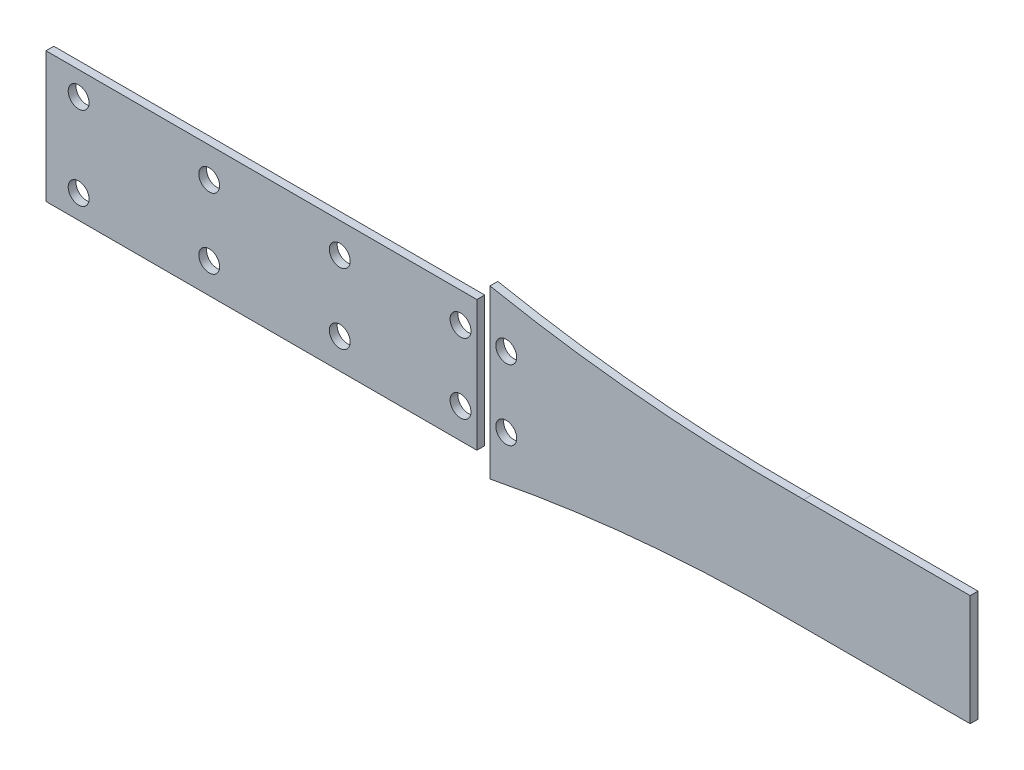
ISO-10303-21;
HEADER;
FILE_DESCRIPTION(('STEP AP214'),'2;1');
FILE_NAME('part.step','',(''),(''),'','','');
FILE_SCHEMA(('AUTOMOTIVE_DESIGN { 1 0 10303 214 1 1 1 1 }'));
ENDSEC;
DATA;
#1=APPLICATION_CONTEXT('core data for automotive mechanical design processes');
#2=APPLICATION_PROTOCOL_DEFINITION('international standard','automotive_design',2000,#1);
#3=PRODUCT_CONTEXT('',#1,'mechanical');
#4=PRODUCT('Part','Part','',(#3));
#5=PRODUCT_RELATED_PRODUCT_CATEGORY('part','',(#4));
#6=PRODUCT_DEFINITION_FORMATION('','',#4);
#7=PRODUCT_DEFINITION_CONTEXT('part definition',#1,'design');
#8=PRODUCT_DEFINITION('design','',#6,#7);
#9=PRODUCT_DEFINITION_SHAPE('','',#8);
#10=(LENGTH_UNIT() NAMED_UNIT(*) SI_UNIT(.MILLI.,.METRE.));
#11=(NAMED_UNIT(*) PLANE_ANGLE_UNIT() SI_UNIT($,.RADIAN.));
#12=(NAMED_UNIT(*) SI_UNIT($,.STERADIAN.) SOLID_ANGLE_UNIT());
#13=UNCERTAINTY_MEASURE_WITH_UNIT(LENGTH_MEASURE(1.E-05),#10,'distance_accuracy_value','');
#14=(GEOMETRIC_REPRESENTATION_CONTEXT(3) GLOBAL_UNCERTAINTY_ASSIGNED_CONTEXT((#13)) GLOBAL_UNIT_ASSIGNED_CONTEXT((#10,
#11,#12)) REPRESENTATION_CONTEXT('',''));
#15=CARTESIAN_POINT('',(0.,0.,0.));
#16=DIRECTION('',(0.,0.,1.));
#17=DIRECTION('',(1.,0.,0.));
#18=AXIS2_PLACEMENT_3D('',#15,#16,#17);
#19=CARTESIAN_POINT('',(134.101357241986,-4.,-0.6));
#20=DIRECTION('',(1.,0.,0.));
#21=DIRECTION('',(0.,0.,-1.));
#22=AXIS2_PLACEMENT_3D('',#19,#20,#21);
#23=PLANE('',#22);
#24=DIRECTION('',(0.,0.,1.));
#25=VECTOR('',#24,1.);
#26=CARTESIAN_POINT('',(134.101357241986,16.,-0.6));
#27=LINE('',#26,#25);
#28=CARTESIAN_POINT('',(134.101357241986,16.,-0.6));
#29=VERTEX_POINT('',#28);
#30=CARTESIAN_POINT('',(134.101357241986,16.,0.6));
#31=VERTEX_POINT('',#30);
#32=EDGE_CURVE('E49',#29,#31,#27,.T.);
#33=ORIENTED_EDGE('',*,*,#32,.T.);
#34=DIRECTION('',(0.,1.,0.));
#35=VECTOR('',#34,1.);
#36=CARTESIAN_POINT('',(134.101357241986,-4.,0.6));
#37=LINE('',#36,#35);
#38=CARTESIAN_POINT('',(134.101357241986,-4.,0.6));
#39=VERTEX_POINT('',#38);
#40=EDGE_CURVE('E86',#39,#31,#37,.T.);
#41=ORIENTED_EDGE('',*,*,#40,.F.);
#42=DIRECTION('',(0.,0.,1.));
#43=VECTOR('',#42,1.);
#44=CARTESIAN_POINT('',(134.101357241986,-4.,-0.6));
#45=LINE('',#44,#43);
#46=CARTESIAN_POINT('',(134.101357241986,-4.,-0.6));
#47=VERTEX_POINT('',#46);
#48=EDGE_CURVE('E12',#47,#39,#45,.T.);
#49=ORIENTED_EDGE('',*,*,#48,.F.);
#50=DIRECTION('',(0.,1.,0.));
#51=VECTOR('',#50,1.);
#52=CARTESIAN_POINT('',(134.101357241986,-4.,-0.6));
#53=LINE('',#52,#51);
#54=EDGE_CURVE('E87',#47,#29,#53,.T.);
#55=ORIENTED_EDGE('',*,*,#54,.T.);
#56=EDGE_LOOP('',(#33,#41,#49,#55));
#57=FACE_BOUND('',#56,.T.);
#58=ADVANCED_FACE('F46',(#57),#23,.T.);
#59=CARTESIAN_POINT('',(68.1013572454792,-4.,-0.6));
#60=DIRECTION('',(0.,-1.,0.));
#61=DIRECTION('',(0.,0.,-1.));
#62=AXIS2_PLACEMENT_3D('',#59,#60,#61);
#63=PLANE('',#62);
#64=ORIENTED_EDGE('',*,*,#48,.T.);
#65=DIRECTION('',(1.,0.,0.));
#66=VECTOR('',#65,1.);
#67=CARTESIAN_POINT('',(68.1013572454792,-4.,0.6));
#68=LINE('',#67,#66);
#69=CARTESIAN_POINT('',(68.1013572454792,-4.,0.6));
#70=VERTEX_POINT('',#69);
#71=EDGE_CURVE('E104',#70,#39,#68,.T.);
#72=ORIENTED_EDGE('',*,*,#71,.F.);
#73=DIRECTION('',(0.,0.,1.));
#74=VECTOR('',#73,1.);
#75=CARTESIAN_POINT('',(68.1013572454792,-4.,-0.6));
#76=LINE('',#75,#74);
#77=CARTESIAN_POINT('',(68.1013572454792,-4.,-0.6));
#78=VERTEX_POINT('',#77);
#79=EDGE_CURVE('E54',#78,#70,#76,.T.);
#80=ORIENTED_EDGE('',*,*,#79,.F.);
#81=DIRECTION('',(1.,0.,0.));
#82=VECTOR('',#81,1.);
#83=CARTESIAN_POINT('',(68.1013572454792,-4.,-0.6));
#84=LINE('',#83,#82);
#85=EDGE_CURVE('E92',#78,#47,#84,.T.);
#86=ORIENTED_EDGE('',*,*,#85,.T.);
#87=EDGE_LOOP('',(#64,#72,#80,#86));
#88=FACE_BOUND('',#87,.T.);
#89=ADVANCED_FACE('F148',(#88),#63,.T.);
#90=CARTESIAN_POINT('',(68.1013572454792,-4.,-0.6));
#91=DIRECTION('',(-1.,0.,0.));
#92=DIRECTION('',(0.,0.,1.));
#93=AXIS2_PLACEMENT_3D('',#90,#91,#92);
#94=PLANE('',#93);
#95=ORIENTED_EDGE('',*,*,#79,.T.);
#96=DIRECTION('',(0.,-1.,0.));
#97=VECTOR('',#96,1.);
#98=CARTESIAN_POINT('',(68.1013572454792,-4.,0.6));
#99=LINE('',#98,#97);
#100=CARTESIAN_POINT('',(68.1013572454792,16.,0.6));
#101=VERTEX_POINT('',#100);
#102=EDGE_CURVE('E99',#101,#70,#99,.T.);
#103=ORIENTED_EDGE('',*,*,#102,.F.);
#104=DIRECTION('',(0.,0.,1.));
#105=VECTOR('',#104,1.);
#106=CARTESIAN_POINT('',(68.1013572454792,16.,-0.6));
#107=LINE('',#106,#105);
#108=CARTESIAN_POINT('',(68.1013572454792,16.,-0.6));
#109=VERTEX_POINT('',#108);
#110=EDGE_CURVE('E91',#109,#101,#107,.T.);
#111=ORIENTED_EDGE('',*,*,#110,.F.);
#112=DIRECTION('',(0.,-1.,0.));
#113=VECTOR('',#112,1.);
#114=CARTESIAN_POINT('',(68.1013572454792,-4.,-0.6));
#115=LINE('',#114,#113);
#116=EDGE_CURVE('E141',#109,#78,#115,.T.);
#117=ORIENTED_EDGE('',*,*,#116,.T.);
#118=EDGE_LOOP('',(#95,#103,#111,#117));
#119=FACE_BOUND('',#118,.T.);
#120=ADVANCED_FACE('F145',(#119),#94,.T.);
#121=CARTESIAN_POINT('',(68.1013572454792,16.,-0.6));
#122=DIRECTION('',(0.,1.,0.));
#123=DIRECTION('',(0.,0.,1.));
#124=AXIS2_PLACEMENT_3D('',#121,#122,#123);
#125=PLANE('',#124);
#126=ORIENTED_EDGE('',*,*,#110,.T.);
#127=DIRECTION('',(-1.,0.,0.));
#128=VECTOR('',#127,1.);
#129=CARTESIAN_POINT('',(68.1013572454792,16.,0.6));
#130=LINE('',#129,#128);
#131=EDGE_CURVE('E94',#31,#101,#130,.T.);
#132=ORIENTED_EDGE('',*,*,#131,.F.);
#133=ORIENTED_EDGE('',*,*,#32,.F.);
#134=DIRECTION('',(-1.,0.,0.));
#135=VECTOR('',#134,1.);
#136=CARTESIAN_POINT('',(68.1013572454792,16.,-0.6));
#137=LINE('',#136,#135);
#138=EDGE_CURVE('E139',#29,#109,#137,.T.);
#139=ORIENTED_EDGE('',*,*,#138,.T.);
#140=EDGE_LOOP('',(#126,#132,#133,#139));
#141=FACE_BOUND('',#140,.T.);
#142=ADVANCED_FACE('F95',(#141),#125,.T.);
#143=CARTESIAN_POINT('',(0.,0.,-0.6));
#144=DIRECTION('',(0.,0.,-1.));
#145=DIRECTION('',(-1.,0.,0.));
#146=AXIS2_PLACEMENT_3D('',#143,#144,#145);
#147=PLANE('',#146);
#148=CARTESIAN_POINT('',(113.10135724548,11.3712812921102,-0.6));
#149=DIRECTION('',(0.,0.,1.));
#150=DIRECTION('',(1.,0.,0.));
#151=AXIS2_PLACEMENT_3D('',#148,#149,#150);
#152=CIRCLE('',#151,1.59999999999999);
#153=CARTESIAN_POINT('',(114.70135724548,11.3712812921102,-0.6));
#154=VERTEX_POINT('',#153);
#155=EDGE_CURVE('E114',#154,#154,#152,.T.);
#156=ORIENTED_EDGE('',*,*,#155,.T.);
#157=EDGE_LOOP('',(#156));
#158=FACE_BOUND('',#157,.T.);
#159=CARTESIAN_POINT('',(113.10135724548,0.628718707889811,-0.6));
#160=DIRECTION('',(0.,0.,1.));
#161=DIRECTION('',(1.,0.,0.));
#162=AXIS2_PLACEMENT_3D('',#159,#160,#161);
#163=CIRCLE('',#162,1.59999999999999);
#164=CARTESIAN_POINT('',(114.70135724548,0.628718707889811,-0.6));
#165=VERTEX_POINT('',#164);
#166=EDGE_CURVE('E117',#165,#165,#163,.T.);
#167=ORIENTED_EDGE('',*,*,#166,.T.);
#168=EDGE_LOOP('',(#167));
#169=FACE_BOUND('',#168,.T.);
#170=CARTESIAN_POINT('',(131.60135724548,11.3712812921102,-0.6));
#171=DIRECTION('',(0.,0.,1.));
#172=DIRECTION('',(1.,0.,0.));
#173=AXIS2_PLACEMENT_3D('',#170,#171,#172);
#174=CIRCLE('',#173,1.59999999999999);
#175=CARTESIAN_POINT('',(133.20135724548,11.3712812921102,-0.6));
#176=VERTEX_POINT('',#175);
#177=EDGE_CURVE('E120',#176,#176,#174,.T.);
#178=ORIENTED_EDGE('',*,*,#177,.T.);
#179=EDGE_LOOP('',(#178));
#180=FACE_BOUND('',#179,.T.);
#181=CARTESIAN_POINT('',(131.60135724548,0.62871870788981,-0.6));
#182=DIRECTION('',(0.,0.,1.));
#183=DIRECTION('',(1.,0.,0.));
#184=AXIS2_PLACEMENT_3D('',#181,#182,#183);
#185=CIRCLE('',#184,1.59999999999999);
#186=CARTESIAN_POINT('',(133.20135724548,0.62871870788981,-0.6));
#187=VERTEX_POINT('',#186);
#188=EDGE_CURVE('E123',#187,#187,#185,.T.);
#189=ORIENTED_EDGE('',*,*,#188,.T.);
#190=EDGE_LOOP('',(#189));
#191=FACE_BOUND('',#190,.T.);
#192=CARTESIAN_POINT('',(93.1013572454803,11.3712812921102,-0.6));
#193=DIRECTION('',(0.,0.,1.));
#194=DIRECTION('',(1.,0.,0.));
#195=AXIS2_PLACEMENT_3D('',#192,#193,#194);
#196=CIRCLE('',#195,1.59999999999999);
#197=CARTESIAN_POINT('',(94.7013572454803,11.3712812921102,-0.6));
#198=VERTEX_POINT('',#197);
#199=EDGE_CURVE('E126',#198,#198,#196,.T.);
#200=ORIENTED_EDGE('',*,*,#199,.T.);
#201=EDGE_LOOP('',(#200));
#202=FACE_BOUND('',#201,.T.);
#203=CARTESIAN_POINT('',(93.1013572454803,0.628718707889795,-0.6));
#204=DIRECTION('',(0.,0.,1.));
#205=DIRECTION('',(1.,0.,0.));
#206=AXIS2_PLACEMENT_3D('',#203,#204,#205);
#207=CIRCLE('',#206,1.59999999999999);
#208=CARTESIAN_POINT('',(94.7013572454803,0.628718707889795,-0.6));
#209=VERTEX_POINT('',#208);
#210=EDGE_CURVE('E129',#209,#209,#207,.T.);
#211=ORIENTED_EDGE('',*,*,#210,.T.);
#212=EDGE_LOOP('',(#211));
#213=FACE_BOUND('',#212,.T.);
#214=CARTESIAN_POINT('',(73.1013572454803,-0.371281292110217,-0.6));
#215=DIRECTION('',(0.,0.,1.));
#216=DIRECTION('',(1.,0.,0.));
#217=AXIS2_PLACEMENT_3D('',#214,#215,#216);
#218=CIRCLE('',#217,1.60000000000001);
#219=CARTESIAN_POINT('',(74.7013572454803,-0.371281292110217,-0.6));
#220=VERTEX_POINT('',#219);
#221=EDGE_CURVE('E132',#220,#220,#218,.T.);
#222=ORIENTED_EDGE('',*,*,#221,.T.);
#223=EDGE_LOOP('',(#222));
#224=FACE_BOUND('',#223,.T.);
#225=CARTESIAN_POINT('',(73.1013572454803,12.3712812921102,-0.6));
#226=DIRECTION('',(0.,0.,1.));
#227=DIRECTION('',(1.,0.,0.));
#228=AXIS2_PLACEMENT_3D('',#225,#226,#227);
#229=CIRCLE('',#228,1.6);
#230=CARTESIAN_POINT('',(74.7013572454803,12.3712812921102,-0.6));
#231=VERTEX_POINT('',#230);
#232=EDGE_CURVE('E135',#231,#231,#229,.T.);
#233=ORIENTED_EDGE('',*,*,#232,.T.);
#234=EDGE_LOOP('',(#233));
#235=FACE_BOUND('',#234,.T.);
#236=ORIENTED_EDGE('',*,*,#54,.F.);
#237=ORIENTED_EDGE('',*,*,#85,.F.);
#238=ORIENTED_EDGE('',*,*,#116,.F.);
#239=ORIENTED_EDGE('',*,*,#138,.F.);
#240=EDGE_LOOP('',(#236,#237,#238,#239));
#241=FACE_BOUND('',#240,.T.);
#242=ADVANCED_FACE('F150',(#158,#169,#180,#191,#202,#213,#224,#235,#241),#147,.T.);
#243=CARTESIAN_POINT('',(73.1013572454803,12.3712812921102,-0.6));
#244=DIRECTION('',(0.,0.,1.));
#245=DIRECTION('',(1.,0.,0.));
#246=AXIS2_PLACEMENT_3D('',#243,#244,#245);
#247=CYLINDRICAL_SURFACE('',#246,1.6);
#248=ORIENTED_EDGE('',*,*,#232,.F.);
#249=EDGE_LOOP('',(#248));
#250=FACE_BOUND('',#249,.T.);
#251=CARTESIAN_POINT('',(73.1013572454803,12.3712812921102,0.6));
#252=DIRECTION('',(0.,0.,1.));
#253=DIRECTION('',(1.,0.,0.));
#254=AXIS2_PLACEMENT_3D('',#251,#252,#253);
#255=CIRCLE('',#254,1.6);
#256=CARTESIAN_POINT('',(74.7013572454803,12.3712812921102,0.6));
#257=VERTEX_POINT('',#256);
#258=EDGE_CURVE('E105',#257,#257,#255,.T.);
#259=ORIENTED_EDGE('',*,*,#258,.T.);
#260=EDGE_LOOP('',(#259));
#261=FACE_BOUND('',#260,.T.);
#262=ADVANCED_FACE('F152',(#250,#261),#247,.F.);
#263=CARTESIAN_POINT('',(73.1013572454803,-0.371281292110217,-0.6));
#264=DIRECTION('',(0.,0.,1.));
#265=DIRECTION('',(1.,0.,0.));
#266=AXIS2_PLACEMENT_3D('',#263,#264,#265);
#267=CYLINDRICAL_SURFACE('',#266,1.60000000000001);
#268=ORIENTED_EDGE('',*,*,#221,.F.);
#269=EDGE_LOOP('',(#268));
#270=FACE_BOUND('',#269,.T.);
#271=CARTESIAN_POINT('',(73.1013572454803,-0.371281292110217,0.6));
#272=DIRECTION('',(0.,0.,1.));
#273=DIRECTION('',(1.,0.,0.));
#274=AXIS2_PLACEMENT_3D('',#271,#272,#273);
#275=CIRCLE('',#274,1.60000000000001);
#276=CARTESIAN_POINT('',(74.7013572454803,-0.371281292110217,0.6));
#277=VERTEX_POINT('',#276);
#278=EDGE_CURVE('E108',#277,#277,#275,.T.);
#279=ORIENTED_EDGE('',*,*,#278,.T.);
#280=EDGE_LOOP('',(#279));
#281=FACE_BOUND('',#280,.T.);
#282=ADVANCED_FACE('F159',(#270,#281),#267,.F.);
#283=CARTESIAN_POINT('',(93.1013572454803,0.628718707889795,-0.6));
#284=DIRECTION('',(0.,0.,1.));
#285=DIRECTION('',(1.,0.,0.));
#286=AXIS2_PLACEMENT_3D('',#283,#284,#285);
#287=CYLINDRICAL_SURFACE('',#286,1.59999999999999);
#288=ORIENTED_EDGE('',*,*,#210,.F.);
#289=EDGE_LOOP('',(#288));
#290=FACE_BOUND('',#289,.T.);
#291=CARTESIAN_POINT('',(93.1013572454803,0.628718707889795,0.6));
#292=DIRECTION('',(0.,0.,1.));
#293=DIRECTION('',(1.,0.,0.));
#294=AXIS2_PLACEMENT_3D('',#291,#292,#293);
#295=CIRCLE('',#294,1.59999999999999);
#296=CARTESIAN_POINT('',(94.7013572454803,0.628718707889795,0.6));
#297=VERTEX_POINT('',#296);
#298=EDGE_CURVE('E289',#297,#297,#295,.T.);
#299=ORIENTED_EDGE('',*,*,#298,.T.);
#300=EDGE_LOOP('',(#299));
#301=FACE_BOUND('',#300,.T.);
#302=ADVANCED_FACE('F197',(#290,#301),#287,.F.);
#303=CARTESIAN_POINT('',(93.1013572454803,11.3712812921102,-0.6));
#304=DIRECTION('',(0.,0.,1.));
#305=DIRECTION('',(1.,0.,0.));
#306=AXIS2_PLACEMENT_3D('',#303,#304,#305);
#307=CYLINDRICAL_SURFACE('',#306,1.59999999999999);
#308=ORIENTED_EDGE('',*,*,#199,.F.);
#309=EDGE_LOOP('',(#308));
#310=FACE_BOUND('',#309,.T.);
#311=CARTESIAN_POINT('',(93.1013572454803,11.3712812921102,0.6));
#312=DIRECTION('',(0.,0.,1.));
#313=DIRECTION('',(1.,0.,0.));
#314=AXIS2_PLACEMENT_3D('',#311,#312,#313);
#315=CIRCLE('',#314,1.59999999999999);
#316=CARTESIAN_POINT('',(94.7013572454803,11.3712812921102,0.6));
#317=VERTEX_POINT('',#316);
#318=EDGE_CURVE('E286',#317,#317,#315,.T.);
#319=ORIENTED_EDGE('',*,*,#318,.T.);
#320=EDGE_LOOP('',(#319));
#321=FACE_BOUND('',#320,.T.);
#322=ADVANCED_FACE('F207',(#310,#321),#307,.F.);
#323=CARTESIAN_POINT('',(131.60135724548,0.62871870788981,-0.6));
#324=DIRECTION('',(0.,0.,1.));
#325=DIRECTION('',(1.,0.,0.));
#326=AXIS2_PLACEMENT_3D('',#323,#324,#325);
#327=CYLINDRICAL_SURFACE('',#326,1.59999999999999);
#328=ORIENTED_EDGE('',*,*,#188,.F.);
#329=EDGE_LOOP('',(#328));
#330=FACE_BOUND('',#329,.T.);
#331=CARTESIAN_POINT('',(131.60135724548,0.62871870788981,0.6));
#332=DIRECTION('',(0.,0.,1.));
#333=DIRECTION('',(1.,0.,0.));
#334=AXIS2_PLACEMENT_3D('',#331,#332,#333);
#335=CIRCLE('',#334,1.59999999999999);
#336=CARTESIAN_POINT('',(133.20135724548,0.62871870788981,0.6));
#337=VERTEX_POINT('',#336);
#338=EDGE_CURVE('E283',#337,#337,#335,.T.);
#339=ORIENTED_EDGE('',*,*,#338,.T.);
#340=EDGE_LOOP('',(#339));
#341=FACE_BOUND('',#340,.T.);
#342=ADVANCED_FACE('F217',(#330,#341),#327,.F.);
#343=CARTESIAN_POINT('',(131.60135724548,11.3712812921102,-0.6));
#344=DIRECTION('',(0.,0.,1.));
#345=DIRECTION('',(1.,0.,0.));
#346=AXIS2_PLACEMENT_3D('',#343,#344,#345);
#347=CYLINDRICAL_SURFACE('',#346,1.59999999999999);
#348=ORIENTED_EDGE('',*,*,#177,.F.);
#349=EDGE_LOOP('',(#348));
#350=FACE_BOUND('',#349,.T.);
#351=CARTESIAN_POINT('',(131.60135724548,11.3712812921102,0.6));
#352=DIRECTION('',(0.,0.,1.));
#353=DIRECTION('',(1.,0.,0.));
#354=AXIS2_PLACEMENT_3D('',#351,#352,#353);
#355=CIRCLE('',#354,1.59999999999999);
#356=CARTESIAN_POINT('',(133.20135724548,11.3712812921102,0.6));
#357=VERTEX_POINT('',#356);
#358=EDGE_CURVE('E278',#357,#357,#355,.T.);
#359=ORIENTED_EDGE('',*,*,#358,.T.);
#360=EDGE_LOOP('',(#359));
#361=FACE_BOUND('',#360,.T.);
#362=ADVANCED_FACE('F227',(#350,#361),#347,.F.);
#363=CARTESIAN_POINT('',(113.10135724548,0.628718707889811,-0.6));
#364=DIRECTION('',(0.,0.,1.));
#365=DIRECTION('',(1.,0.,0.));
#366=AXIS2_PLACEMENT_3D('',#363,#364,#365);
#367=CYLINDRICAL_SURFACE('',#366,1.59999999999999);
#368=ORIENTED_EDGE('',*,*,#166,.F.);
#369=EDGE_LOOP('',(#368));
#370=FACE_BOUND('',#369,.T.);
#371=CARTESIAN_POINT('',(113.10135724548,0.628718707889811,0.6));
#372=DIRECTION('',(0.,0.,1.));
#373=DIRECTION('',(1.,0.,0.));
#374=AXIS2_PLACEMENT_3D('',#371,#372,#373);
#375=CIRCLE('',#374,1.59999999999999);
#376=CARTESIAN_POINT('',(114.70135724548,0.628718707889811,0.6));
#377=VERTEX_POINT('',#376);
#378=EDGE_CURVE('E275',#377,#377,#375,.T.);
#379=ORIENTED_EDGE('',*,*,#378,.T.);
#380=EDGE_LOOP('',(#379));
#381=FACE_BOUND('',#380,.T.);
#382=ADVANCED_FACE('F237',(#370,#381),#367,.F.);
#383=CARTESIAN_POINT('',(113.10135724548,11.3712812921102,-0.6));
#384=DIRECTION('',(0.,0.,1.));
#385=DIRECTION('',(1.,0.,0.));
#386=AXIS2_PLACEMENT_3D('',#383,#384,#385);
#387=CYLINDRICAL_SURFACE('',#386,1.59999999999999);
#388=ORIENTED_EDGE('',*,*,#155,.F.);
#389=EDGE_LOOP('',(#388));
#390=FACE_BOUND('',#389,.T.);
#391=CARTESIAN_POINT('',(113.10135724548,11.3712812921102,0.6));
#392=DIRECTION('',(0.,0.,1.));
#393=DIRECTION('',(1.,0.,0.));
#394=AXIS2_PLACEMENT_3D('',#391,#392,#393);
#395=CIRCLE('',#394,1.59999999999999);
#396=CARTESIAN_POINT('',(114.70135724548,11.3712812921102,0.6));
#397=VERTEX_POINT('',#396);
#398=EDGE_CURVE('E273',#397,#397,#395,.T.);
#399=ORIENTED_EDGE('',*,*,#398,.T.);
#400=EDGE_LOOP('',(#399));
#401=FACE_BOUND('',#400,.T.);
#402=ADVANCED_FACE('F247',(#390,#401),#387,.F.);
#403=CARTESIAN_POINT('',(0.,0.,0.6));
#404=DIRECTION('',(0.,0.,-1.));
#405=DIRECTION('',(-1.,0.,0.));
#406=AXIS2_PLACEMENT_3D('',#403,#404,#405);
#407=PLANE('',#406);
#408=ORIENTED_EDGE('',*,*,#40,.T.);
#409=ORIENTED_EDGE('',*,*,#131,.T.);
#410=ORIENTED_EDGE('',*,*,#102,.T.);
#411=ORIENTED_EDGE('',*,*,#71,.T.);
#412=EDGE_LOOP('',(#408,#409,#410,#411));
#413=FACE_BOUND('',#412,.T.);
#414=ORIENTED_EDGE('',*,*,#258,.F.);
#415=EDGE_LOOP('',(#414));
#416=FACE_BOUND('',#415,.T.);
#417=ORIENTED_EDGE('',*,*,#278,.F.);
#418=EDGE_LOOP('',(#417));
#419=FACE_BOUND('',#418,.T.);
#420=ORIENTED_EDGE('',*,*,#298,.F.);
#421=EDGE_LOOP('',(#420));
#422=FACE_BOUND('',#421,.T.);
#423=ORIENTED_EDGE('',*,*,#318,.F.);
#424=EDGE_LOOP('',(#423));
#425=FACE_BOUND('',#424,.T.);
#426=ORIENTED_EDGE('',*,*,#338,.F.);
#427=EDGE_LOOP('',(#426));
#428=FACE_BOUND('',#427,.T.);
#429=ORIENTED_EDGE('',*,*,#358,.F.);
#430=EDGE_LOOP('',(#429));
#431=FACE_BOUND('',#430,.T.);
#432=ORIENTED_EDGE('',*,*,#378,.F.);
#433=EDGE_LOOP('',(#432));
#434=FACE_BOUND('',#433,.T.);
#435=ORIENTED_EDGE('',*,*,#398,.F.);
#436=EDGE_LOOP('',(#435));
#437=FACE_BOUND('',#436,.T.);
#438=ADVANCED_FACE('F102',(#413,#416,#419,#422,#425,#428,#431,#434,#437),#407,.F.);
#439=CLOSED_SHELL('',(#58,#89,#120,#142,#242,#262,#282,#302,#322,#342,#362,#382,#402,#438));
#440=MANIFOLD_SOLID_BREP('B2',#439);
#441=CARTESIAN_POINT('',(184.174027055347,-2.4999999999517,-0.6));
#442=CARTESIAN_POINT('',(183.82425342742,-2.4999999999517,-0.6));
#443=CARTESIAN_POINT('',(182.946206390618,-2.4999999999517,-0.6));
#444=CARTESIAN_POINT('',(181.667799962979,-2.4999999999517,-0.6));
#445=CARTESIAN_POINT('',(180.804171147933,-2.4999999999517,-0.6));
#446=CARTESIAN_POINT('',(176.695940371431,-2.49999999995173,-0.6));
#447=CARTESIAN_POINT('',(170.015725266685,-2.67013831836304,-0.6));
#448=CARTESIAN_POINT('',(160.683426305428,-3.28256939436893,-0.6));
#449=CARTESIAN_POINT('',(151.378685363738,-4.27293628119086,-0.6));
#450=CARTESIAN_POINT('',(144.757083805341,-5.24750389890649,-0.6));
#451=CARTESIAN_POINT('',(139.459652196369,-6.16603381365866,-0.6));
#452=CARTESIAN_POINT('',(137.792001295776,-6.47360431339592,-0.6));
#453=CARTESIAN_POINT('',(136.101357242702,-6.80538489626025,-0.6));
#454=B_SPLINE_CURVE_WITH_KNOTS('',3,(#441,#442,#443,#444,#445,#446,#447,#448,#449,#450,#451,
#452,#453),.UNSPECIFIED.,.F.,.F.,(4,1,1,2,1,1,1,2,4),(0.0438298496649367,0.045875995839188,
0.0491763596153729,0.0524767233915578,0.0823224199373389,0.11216811648312,0.142013813028901,
0.171859509574682,0.185262544514931),.UNSPECIFIED.);
#455=DIRECTION('',(0.,0.,1.));
#456=VECTOR('',#455,1.);
#457=SURFACE_OF_LINEAR_EXTRUSION('',#454,#456);
#458=DIRECTION('',(0.,0.,1.));
#459=VECTOR('',#458,1.);
#460=CARTESIAN_POINT('',(184.174027055347,-2.4999999999517,-0.6));
#461=LINE('',#460,#459);
#462=CARTESIAN_POINT('',(184.174027055347,-2.4999999999517,-0.6));
#463=VERTEX_POINT('',#462);
#464=CARTESIAN_POINT('',(184.174027055347,-2.4999999999517,0.6));
#465=VERTEX_POINT('',#464);
#466=EDGE_CURVE('E391',#463,#465,#461,.T.);
#467=ORIENTED_EDGE('',*,*,#466,.T.);
#468=CARTESIAN_POINT('',(184.174027055347,-2.4999999999517,0.6));
#469=CARTESIAN_POINT('',(183.82425342742,-2.4999999999517,0.6));
#470=CARTESIAN_POINT('',(182.946206390618,-2.4999999999517,0.6));
#471=CARTESIAN_POINT('',(181.667799962979,-2.4999999999517,0.6));
#472=CARTESIAN_POINT('',(180.804171147933,-2.4999999999517,0.6));
#473=CARTESIAN_POINT('',(176.695940371431,-2.49999999995173,0.6));
#474=CARTESIAN_POINT('',(170.015725266685,-2.67013831836304,0.6));
#475=CARTESIAN_POINT('',(160.683426305428,-3.28256939436893,0.6));
#476=CARTESIAN_POINT('',(151.378685363738,-4.27293628119086,0.6));
#477=CARTESIAN_POINT('',(144.757083805341,-5.24750389890649,0.6));
#478=CARTESIAN_POINT('',(139.459652196369,-6.16603381365866,0.6));
#479=CARTESIAN_POINT('',(137.792001295776,-6.47360431339592,0.6));
#480=CARTESIAN_POINT('',(136.101357242702,-6.80538489626025,0.6));
#481=B_SPLINE_CURVE_WITH_KNOTS('',3,(#468,#469,#470,#471,#472,#473,#474,#475,#476,#477,#478,
#479,#480),.UNSPECIFIED.,.F.,.F.,(4,1,1,2,1,1,1,2,4),(0.0438298496649367,0.045875995839188,
0.0491763596153729,0.0524767233915578,0.0823224199373389,0.11216811648312,0.142013813028901,
0.171859509574682,0.185262544514931),.UNSPECIFIED.);
#482=CARTESIAN_POINT('',(136.101357245481,-6.80538489571497,0.6));
#483=VERTEX_POINT('',#482);
#484=EDGE_CURVE('E394',#465,#483,#481,.T.);
#485=ORIENTED_EDGE('',*,*,#484,.T.);
#486=DIRECTION('',(0.,0.,1.));
#487=VECTOR('',#486,1.);
#488=CARTESIAN_POINT('',(136.101357245481,-6.80538489571497,-0.6));
#489=LINE('',#488,#487);
#490=CARTESIAN_POINT('',(136.101357245481,-6.80538489571497,-0.6));
#491=VERTEX_POINT('',#490);
#492=EDGE_CURVE('E44',#491,#483,#489,.T.);
#493=ORIENTED_EDGE('',*,*,#492,.F.);
#494=CARTESIAN_POINT('',(136.101357242702,-6.80538489626025,-0.6));
#495=CARTESIAN_POINT('',(137.792001295776,-6.47360431339592,-0.6));
#496=CARTESIAN_POINT('',(139.459652196369,-6.16603381365866,-0.6));
#497=CARTESIAN_POINT('',(144.757083805341,-5.24750389890649,-0.6));
#498=CARTESIAN_POINT('',(151.378685363738,-4.27293628119086,-0.6));
#499=CARTESIAN_POINT('',(160.683426305428,-3.28256939436893,-0.6));
#500=CARTESIAN_POINT('',(170.015725266685,-2.67013831836304,-0.6));
#501=CARTESIAN_POINT('',(176.695940371431,-2.49999999995173,-0.6));
#502=CARTESIAN_POINT('',(180.804171147933,-2.4999999999517,-0.6));
#503=CARTESIAN_POINT('',(181.667799962979,-2.4999999999517,-0.6));
#504=CARTESIAN_POINT('',(182.946206390618,-2.4999999999517,-0.6));
#505=CARTESIAN_POINT('',(183.82425342742,-2.4999999999517,-0.6));
#506=CARTESIAN_POINT('',(184.174027055347,-2.4999999999517,-0.6));
#507=B_SPLINE_CURVE_WITH_KNOTS('',3,(#494,#495,#496,#497,#498,#499,#500,#501,#502,#503,#504,
#505,#506),.UNSPECIFIED.,.F.,.F.,(4,2,1,1,1,2,1,1,4),(0.0438298496649367,0.0572328846051855,
0.0870785811509665,0.116924277696748,0.146769974242529,0.17661567078831,0.179916034564495,
0.18321639834068,0.185262544514931),.UNSPECIFIED.);
#508=EDGE_CURVE('E397',#463,#491,#507,.F.);
#509=ORIENTED_EDGE('',*,*,#508,.F.);
#510=EDGE_LOOP('',(#467,#485,#493,#509));
#511=FACE_BOUND('',#510,.T.);
#512=ADVANCED_FACE('F337',(#511),#457,.F.);
#513=CARTESIAN_POINT('',(136.101357245481,2.94998669948666E-13,-0.6));
#514=DIRECTION('',(1.,0.,0.));
#515=DIRECTION('',(0.,1.,0.));
#516=AXIS2_PLACEMENT_3D('',#513,#514,#515);
#517=PLANE('',#516);
#518=ORIENTED_EDGE('',*,*,#492,.T.);
#519=DIRECTION('',(0.,1.,0.));
#520=VECTOR('',#519,1.);
#521=CARTESIAN_POINT('',(136.101357245481,2.94998669948666E-13,0.6));
#522=LINE('',#521,#520);
#523=CARTESIAN_POINT('',(136.101357245481,18.805384895715,0.6));
#524=VERTEX_POINT('',#523);
#525=EDGE_CURVE('E413',#483,#524,#522,.T.);
#526=ORIENTED_EDGE('',*,*,#525,.T.);
#527=DIRECTION('',(0.,0.,1.));
#528=VECTOR('',#527,1.);
#529=CARTESIAN_POINT('',(136.101357245481,18.805384895715,-0.6));
#530=LINE('',#529,#528);
#531=CARTESIAN_POINT('',(136.101357245481,18.805384895715,-0.6));
#532=VERTEX_POINT('',#531);
#533=EDGE_CURVE('E347',#532,#524,#530,.T.);
#534=ORIENTED_EDGE('',*,*,#533,.F.);
#535=DIRECTION('',(0.,1.,0.));
#536=VECTOR('',#535,1.);
#537=CARTESIAN_POINT('',(136.101357245481,2.94998669948666E-13,-0.6));
#538=LINE('',#537,#536);
#539=EDGE_CURVE('E354',#491,#532,#538,.T.);
#540=ORIENTED_EDGE('',*,*,#539,.F.);
#541=EDGE_LOOP('',(#518,#526,#534,#540));
#542=FACE_BOUND('',#541,.T.);
#543=ADVANCED_FACE('F455',(#542),#517,.F.);
#544=CARTESIAN_POINT('',(184.174027055092,14.5000000000018,-0.6));
#545=CARTESIAN_POINT('',(183.824253427165,14.5000000000018,-0.6));
#546=CARTESIAN_POINT('',(182.946206390362,14.5000000000018,-0.6));
#547=CARTESIAN_POINT('',(181.667799962724,14.5000000000018,-0.6));
#548=CARTESIAN_POINT('',(180.804171147677,14.5000000000018,-0.6));
#549=CARTESIAN_POINT('',(176.695940371176,14.5000000000018,-0.6));
#550=CARTESIAN_POINT('',(170.015725266429,14.6701383184131,-0.6));
#551=CARTESIAN_POINT('',(160.683426305172,15.282569394419,-0.6));
#552=CARTESIAN_POINT('',(151.378685363482,16.272936281241,-0.6));
#553=CARTESIAN_POINT('',(144.757083805085,17.2475038989566,-0.6));
#554=CARTESIAN_POINT('',(139.459652196197,18.1660338136944,-0.6));
#555=CARTESIAN_POINT('',(137.792001295689,18.473604313415,-0.6));
#556=CARTESIAN_POINT('',(136.101357242702,18.8053848962602,-0.6));
#557=B_SPLINE_CURVE_WITH_KNOTS('',3,(#544,#545,#546,#547,#548,#549,#550,#551,#552,#553,#554,
#555,#556),.UNSPECIFIED.,.F.,.F.,(4,1,1,2,1,1,1,2,4),(0.0438298496649367,0.045875995839188,
0.0491763596153729,0.0524767233915578,0.0823224199373389,0.11216811648312,0.142013813028901,
0.171859509574682,0.185262544514256),.UNSPECIFIED.);
#558=DIRECTION('',(0.,0.,1.));
#559=VECTOR('',#558,1.);
#560=SURFACE_OF_LINEAR_EXTRUSION('',#557,#559);
#561=ORIENTED_EDGE('',*,*,#533,.T.);
#562=CARTESIAN_POINT('',(136.101357242702,18.8053848962602,0.6));
#563=CARTESIAN_POINT('',(137.792001295689,18.473604313415,0.6));
#564=CARTESIAN_POINT('',(139.459652196197,18.1660338136944,0.6));
#565=CARTESIAN_POINT('',(144.757083805085,17.2475038989566,0.6));
#566=CARTESIAN_POINT('',(151.378685363482,16.272936281241,0.6));
#567=CARTESIAN_POINT('',(160.683426305172,15.282569394419,0.6));
#568=CARTESIAN_POINT('',(170.015725266429,14.6701383184131,0.6));
#569=CARTESIAN_POINT('',(176.695940371176,14.5000000000018,0.6));
#570=CARTESIAN_POINT('',(180.804171147677,14.5000000000018,0.6));
#571=CARTESIAN_POINT('',(181.667799962724,14.5000000000018,0.6));
#572=CARTESIAN_POINT('',(182.946206390362,14.5000000000018,0.6));
#573=CARTESIAN_POINT('',(183.824253427165,14.5000000000018,0.6));
#574=CARTESIAN_POINT('',(184.174027055092,14.5000000000018,0.6));
#575=B_SPLINE_CURVE_WITH_KNOTS('',3,(#562,#563,#564,#565,#566,#567,#568,#569,#570,#571,#572,
#573,#574),.UNSPECIFIED.,.F.,.F.,(4,2,1,1,1,2,1,1,4),(0.0438298496649367,0.0572328846045103,
0.0870785811502914,0.116924277696072,0.146769974241853,0.176615670787635,0.179916034563819,
0.183216398340004,0.185262544514256),.UNSPECIFIED.);
#576=CARTESIAN_POINT('',(184.174027055092,14.5000000000018,0.6));
#577=VERTEX_POINT('',#576);
#578=EDGE_CURVE('E499',#577,#524,#575,.F.);
#579=ORIENTED_EDGE('',*,*,#578,.F.);
#580=DIRECTION('',(0.,0.,1.));
#581=VECTOR('',#580,1.);
#582=CARTESIAN_POINT('',(184.174027055092,14.5000000000018,-0.6));
#583=LINE('',#582,#581);
#584=CARTESIAN_POINT('',(184.174027055092,14.5000000000018,-0.6));
#585=VERTEX_POINT('',#584);
#586=EDGE_CURVE('E557',#585,#577,#583,.T.);
#587=ORIENTED_EDGE('',*,*,#586,.F.);
#588=CARTESIAN_POINT('',(184.174027055092,14.5000000000018,-0.6));
#589=CARTESIAN_POINT('',(183.824253427165,14.5000000000018,-0.6));
#590=CARTESIAN_POINT('',(182.946206390362,14.5000000000018,-0.6));
#591=CARTESIAN_POINT('',(181.667799962724,14.5000000000018,-0.6));
#592=CARTESIAN_POINT('',(180.804171147677,14.5000000000018,-0.6));
#593=CARTESIAN_POINT('',(176.695940371176,14.5000000000018,-0.6));
#594=CARTESIAN_POINT('',(170.015725266429,14.6701383184131,-0.6));
#595=CARTESIAN_POINT('',(160.683426305172,15.282569394419,-0.6));
#596=CARTESIAN_POINT('',(151.378685363482,16.272936281241,-0.6));
#597=CARTESIAN_POINT('',(144.757083805085,17.2475038989566,-0.6));
#598=CARTESIAN_POINT('',(139.459652196197,18.1660338136944,-0.6));
#599=CARTESIAN_POINT('',(137.792001295689,18.473604313415,-0.6));
#600=CARTESIAN_POINT('',(136.101357242702,18.8053848962602,-0.6));
#601=B_SPLINE_CURVE_WITH_KNOTS('',3,(#588,#589,#590,#591,#592,#593,#594,#595,#596,#597,#598,
#599,#600),.UNSPECIFIED.,.F.,.F.,(4,1,1,2,1,1,1,2,4),(0.0438298496649367,0.045875995839188,
0.0491763596153729,0.0524767233915578,0.0823224199373389,0.11216811648312,0.142013813028901,
0.171859509574682,0.185262544514256),.UNSPECIFIED.);
#602=EDGE_CURVE('E561',#585,#532,#601,.T.);
#603=ORIENTED_EDGE('',*,*,#602,.T.);
#604=EDGE_LOOP('',(#561,#579,#587,#603));
#605=FACE_BOUND('',#604,.T.);
#606=ADVANCED_FACE('F449',(#605),#560,.T.);
#607=CARTESIAN_POINT('',(1.15566193243311E-12,14.5000000000165,-0.6));
#608=DIRECTION('',(0.,-1.,0.));
#609=DIRECTION('',(1.,0.,0.));
#610=AXIS2_PLACEMENT_3D('',#607,#608,#609);
#611=PLANE('',#610);
#612=ORIENTED_EDGE('',*,*,#586,.T.);
#613=DIRECTION('',(1.,0.,0.));
#614=VECTOR('',#613,1.);
#615=CARTESIAN_POINT('',(1.15566193243311E-12,14.5000000000165,0.6));
#616=LINE('',#615,#614);
#617=CARTESIAN_POINT('',(209.661357245477,14.4999999999998,0.6));
#618=VERTEX_POINT('',#617);
#619=EDGE_CURVE('E421',#577,#618,#616,.T.);
#620=ORIENTED_EDGE('',*,*,#619,.T.);
#621=DIRECTION('',(0.,0.,1.));
#622=VECTOR('',#621,1.);
#623=CARTESIAN_POINT('',(209.661357245477,14.4999999999998,-0.6));
#624=LINE('',#623,#622);
#625=CARTESIAN_POINT('',(209.661357245477,14.4999999999998,-0.6));
#626=VERTEX_POINT('',#625);
#627=EDGE_CURVE('E443',#626,#618,#624,.T.);
#628=ORIENTED_EDGE('',*,*,#627,.F.);
#629=DIRECTION('',(1.,0.,0.));
#630=VECTOR('',#629,1.);
#631=CARTESIAN_POINT('',(1.15566193243311E-12,14.5000000000165,-0.6));
#632=LINE('',#631,#630);
#633=EDGE_CURVE('E437',#585,#626,#632,.T.);
#634=ORIENTED_EDGE('',*,*,#633,.F.);
#635=EDGE_LOOP('',(#612,#620,#628,#634));
#636=FACE_BOUND('',#635,.T.);
#637=ADVANCED_FACE('F454',(#636),#611,.F.);
#638=CARTESIAN_POINT('',(209.661357245477,0.,-0.6));
#639=DIRECTION('',(-1.,0.,0.));
#640=DIRECTION('',(0.,0.,1.));
#641=AXIS2_PLACEMENT_3D('',#638,#639,#640);
#642=PLANE('',#641);
#643=ORIENTED_EDGE('',*,*,#627,.T.);
#644=DIRECTION('',(0.,-1.,0.));
#645=VECTOR('',#644,1.);
#646=CARTESIAN_POINT('',(209.661357245477,0.,0.6));
#647=LINE('',#646,#645);
#648=CARTESIAN_POINT('',(209.661357245477,-2.4999999999517,0.6));
#649=VERTEX_POINT('',#648);
#650=EDGE_CURVE('E419',#618,#649,#647,.T.);
#651=ORIENTED_EDGE('',*,*,#650,.T.);
#652=DIRECTION('',(0.,0.,1.));
#653=VECTOR('',#652,1.);
#654=CARTESIAN_POINT('',(209.661357245477,-2.4999999999517,-0.6));
#655=LINE('',#654,#653);
#656=CARTESIAN_POINT('',(209.661357245477,-2.4999999999517,-0.6));
#657=VERTEX_POINT('',#656);
#658=EDGE_CURVE('E402',#657,#649,#655,.T.);
#659=ORIENTED_EDGE('',*,*,#658,.F.);
#660=DIRECTION('',(0.,-1.,0.));
#661=VECTOR('',#660,1.);
#662=CARTESIAN_POINT('',(209.661357245477,0.,-0.6));
#663=LINE('',#662,#661);
#664=EDGE_CURVE('E432',#626,#657,#663,.T.);
#665=ORIENTED_EDGE('',*,*,#664,.F.);
#666=EDGE_LOOP('',(#643,#651,#659,#665));
#667=FACE_BOUND('',#666,.T.);
#668=ADVANCED_FACE('F559',(#667),#642,.F.);
#669=CARTESIAN_POINT('',(0.,-2.49999999995173,-0.6));
#670=DIRECTION('',(0.,1.,0.));
#671=DIRECTION('',(-1.,0.,0.));
#672=AXIS2_PLACEMENT_3D('',#669,#670,#671);
#673=PLANE('',#672);
#674=ORIENTED_EDGE('',*,*,#658,.T.);
#675=DIRECTION('',(-1.,0.,0.));
#676=VECTOR('',#675,1.);
#677=CARTESIAN_POINT('',(0.,-2.49999999995173,0.6));
#678=LINE('',#677,#676);
#679=EDGE_CURVE('E409',#649,#465,#678,.T.);
#680=ORIENTED_EDGE('',*,*,#679,.T.);
#681=ORIENTED_EDGE('',*,*,#466,.F.);
#682=DIRECTION('',(-1.,0.,0.));
#683=VECTOR('',#682,1.);
#684=CARTESIAN_POINT('',(0.,-2.49999999995173,-0.6));
#685=LINE('',#684,#683);
#686=EDGE_CURVE('E438',#657,#463,#685,.T.);
#687=ORIENTED_EDGE('',*,*,#686,.F.);
#688=EDGE_LOOP('',(#674,#680,#681,#687));
#689=FACE_BOUND('',#688,.T.);
#690=ADVANCED_FACE('F417',(#689),#673,.F.);
#691=CARTESIAN_POINT('',(0.,0.,-0.6));
#692=DIRECTION('',(0.,0.,1.));
#693=DIRECTION('',(1.,0.,0.));
#694=AXIS2_PLACEMENT_3D('',#691,#692,#693);
#695=PLANE('',#694);
#696=CARTESIAN_POINT('',(138.60135724548,11.3712812921102,-0.6));
#697=DIRECTION('',(0.,0.,1.));
#698=DIRECTION('',(1.,0.,0.));
#699=AXIS2_PLACEMENT_3D('',#696,#697,#698);
#700=CIRCLE('',#699,1.59999999999999);
#701=CARTESIAN_POINT('',(140.20135724548,11.3712812921102,-0.6));
#702=VERTEX_POINT('',#701);
#703=EDGE_CURVE('E414',#702,#702,#700,.T.);
#704=ORIENTED_EDGE('',*,*,#703,.T.);
#705=EDGE_LOOP('',(#704));
#706=FACE_BOUND('',#705,.T.);
#707=CARTESIAN_POINT('',(138.60135724548,0.62871870788981,-0.6));
#708=DIRECTION('',(0.,0.,1.));
#709=DIRECTION('',(1.,0.,0.));
#710=AXIS2_PLACEMENT_3D('',#707,#708,#709);
#711=CIRCLE('',#710,1.59999999999999);
#712=CARTESIAN_POINT('',(140.20135724548,0.62871870788981,-0.6));
#713=VERTEX_POINT('',#712);
#714=EDGE_CURVE('E486',#713,#713,#711,.T.);
#715=ORIENTED_EDGE('',*,*,#714,.T.);
#716=EDGE_LOOP('',(#715));
#717=FACE_BOUND('',#716,.T.);
#718=ORIENTED_EDGE('',*,*,#508,.T.);
#719=ORIENTED_EDGE('',*,*,#539,.T.);
#720=ORIENTED_EDGE('',*,*,#602,.F.);
#721=ORIENTED_EDGE('',*,*,#633,.T.);
#722=ORIENTED_EDGE('',*,*,#664,.T.);
#723=ORIENTED_EDGE('',*,*,#686,.T.);
#724=EDGE_LOOP('',(#718,#719,#720,#721,#722,#723));
#725=FACE_BOUND('',#724,.T.);
#726=ADVANCED_FACE('F513',(#706,#717,#725),#695,.F.);
#727=CARTESIAN_POINT('',(0.,0.,0.6));
#728=DIRECTION('',(0.,0.,1.));
#729=DIRECTION('',(1.,0.,0.));
#730=AXIS2_PLACEMENT_3D('',#727,#728,#729);
#731=PLANE('',#730);
#732=CARTESIAN_POINT('',(138.60135724548,11.3712812921102,0.6));
#733=DIRECTION('',(0.,0.,1.));
#734=DIRECTION('',(1.,0.,0.));
#735=AXIS2_PLACEMENT_3D('',#732,#733,#734);
#736=CIRCLE('',#735,1.59999999999999);
#737=CARTESIAN_POINT('',(140.20135724548,11.3712812921102,0.6));
#738=VERTEX_POINT('',#737);
#739=EDGE_CURVE('E342',#738,#738,#736,.T.);
#740=ORIENTED_EDGE('',*,*,#739,.F.);
#741=EDGE_LOOP('',(#740));
#742=FACE_BOUND('',#741,.T.);
#743=CARTESIAN_POINT('',(138.60135724548,0.62871870788981,0.6));
#744=DIRECTION('',(0.,0.,1.));
#745=DIRECTION('',(1.,0.,0.));
#746=AXIS2_PLACEMENT_3D('',#743,#744,#745);
#747=CIRCLE('',#746,1.59999999999999);
#748=CARTESIAN_POINT('',(140.20135724548,0.62871870788981,0.6));
#749=VERTEX_POINT('',#748);
#750=EDGE_CURVE('E479',#749,#749,#747,.T.);
#751=ORIENTED_EDGE('',*,*,#750,.F.);
#752=EDGE_LOOP('',(#751));
#753=FACE_BOUND('',#752,.T.);
#754=ORIENTED_EDGE('',*,*,#484,.F.);
#755=ORIENTED_EDGE('',*,*,#679,.F.);
#756=ORIENTED_EDGE('',*,*,#650,.F.);
#757=ORIENTED_EDGE('',*,*,#619,.F.);
#758=ORIENTED_EDGE('',*,*,#578,.T.);
#759=ORIENTED_EDGE('',*,*,#525,.F.);
#760=EDGE_LOOP('',(#754,#755,#756,#757,#758,#759));
#761=FACE_BOUND('',#760,.T.);
#762=ADVANCED_FACE('F407',(#742,#753,#761),#731,.T.);
#763=CARTESIAN_POINT('',(138.60135724548,0.62871870788981,-0.65));
#764=DIRECTION('',(0.,0.,1.));
#765=DIRECTION('',(1.,0.,0.));
#766=AXIS2_PLACEMENT_3D('',#763,#764,#765);
#767=CYLINDRICAL_SURFACE('',#766,1.59999999999999);
#768=ORIENTED_EDGE('',*,*,#750,.T.);
#769=EDGE_LOOP('',(#768));
#770=FACE_BOUND('',#769,.T.);
#771=ORIENTED_EDGE('',*,*,#714,.F.);
#772=EDGE_LOOP('',(#771));
#773=FACE_BOUND('',#772,.T.);
#774=ADVANCED_FACE('F512',(#770,#773),#767,.F.);
#775=CARTESIAN_POINT('',(138.60135724548,11.3712812921102,-0.65));
#776=DIRECTION('',(0.,0.,1.));
#777=DIRECTION('',(1.,0.,0.));
#778=AXIS2_PLACEMENT_3D('',#775,#776,#777);
#779=CYLINDRICAL_SURFACE('',#778,1.59999999999999);
#780=ORIENTED_EDGE('',*,*,#739,.T.);
#781=EDGE_LOOP('',(#780));
#782=FACE_BOUND('',#781,.T.);
#783=ORIENTED_EDGE('',*,*,#703,.F.);
#784=EDGE_LOOP('',(#783));
#785=FACE_BOUND('',#784,.T.);
#786=ADVANCED_FACE('F632',(#782,#785),#779,.F.);
#787=CLOSED_SHELL('',(#512,#543,#606,#637,#668,#690,#726,#762,#774,#786));
#788=MANIFOLD_SOLID_BREP('B6',#787);
#789=ADVANCED_BREP_SHAPE_REPRESENTATION('',(#18,#440,#788),#14);
#790=SHAPE_DEFINITION_REPRESENTATION(#9,#789);
ENDSEC;
END-ISO-10303-21;
